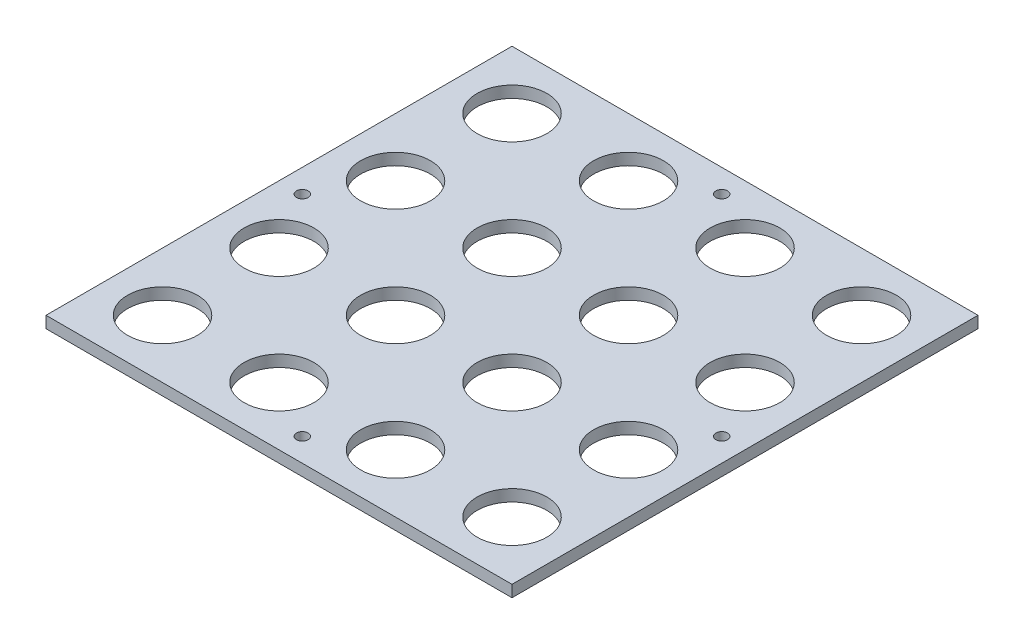
ISO-10303-21;
HEADER;
FILE_DESCRIPTION(('STEP AP214'),'2;1');
FILE_NAME('part.step','',(''),(''),'','','');
FILE_SCHEMA(('AUTOMOTIVE_DESIGN { 1 0 10303 214 1 1 1 1 }'));
ENDSEC;
DATA;
#1=APPLICATION_CONTEXT('core data for automotive mechanical design processes');
#2=APPLICATION_PROTOCOL_DEFINITION('international standard','automotive_design',2000,#1);
#3=PRODUCT_CONTEXT('',#1,'mechanical');
#4=PRODUCT('Part','Part','',(#3));
#5=PRODUCT_RELATED_PRODUCT_CATEGORY('part','',(#4));
#6=PRODUCT_DEFINITION_FORMATION('','',#4);
#7=PRODUCT_DEFINITION_CONTEXT('part definition',#1,'design');
#8=PRODUCT_DEFINITION('design','',#6,#7);
#9=PRODUCT_DEFINITION_SHAPE('','',#8);
#10=(LENGTH_UNIT() NAMED_UNIT(*) SI_UNIT(.MILLI.,.METRE.));
#11=(NAMED_UNIT(*) PLANE_ANGLE_UNIT() SI_UNIT($,.RADIAN.));
#12=(NAMED_UNIT(*) SI_UNIT($,.STERADIAN.) SOLID_ANGLE_UNIT());
#13=UNCERTAINTY_MEASURE_WITH_UNIT(LENGTH_MEASURE(1.E-05),#10,'distance_accuracy_value','');
#14=(GEOMETRIC_REPRESENTATION_CONTEXT(3) GLOBAL_UNCERTAINTY_ASSIGNED_CONTEXT((#13)) GLOBAL_UNIT_ASSIGNED_CONTEXT((#10,
#11,#12)) REPRESENTATION_CONTEXT('',''));
#15=CARTESIAN_POINT('',(0.,0.,0.));
#16=DIRECTION('',(0.,0.,1.));
#17=DIRECTION('',(1.,0.,0.));
#18=AXIS2_PLACEMENT_3D('',#15,#16,#17);
#19=CARTESIAN_POINT('',(0.,6.35,0.));
#20=DIRECTION('',(0.,1.,0.));
#21=DIRECTION('',(0.,0.,1.));
#22=AXIS2_PLACEMENT_3D('',#19,#20,#21);
#23=PLANE('',#22);
#24=CARTESIAN_POINT('',(-95.2499999999987,6.35,31.7499999999999));
#25=DIRECTION('',(0.,1.,0.));
#26=DIRECTION('',(0.,0.,1.));
#27=AXIS2_PLACEMENT_3D('',#24,#25,#26);
#28=CIRCLE('',#27,19.);
#29=CARTESIAN_POINT('',(-95.2499999999987,6.35,50.7499999999999));
#30=VERTEX_POINT('',#29);
#31=EDGE_CURVE('E218',#30,#30,#28,.T.);
#32=ORIENTED_EDGE('',*,*,#31,.F.);
#33=EDGE_LOOP('',(#32));
#34=FACE_BOUND('',#33,.T.);
#35=CARTESIAN_POINT('',(95.2500000000019,6.35,95.2499999999999));
#36=DIRECTION('',(0.,1.,0.));
#37=DIRECTION('',(0.,0.,1.));
#38=AXIS2_PLACEMENT_3D('',#35,#36,#37);
#39=CIRCLE('',#38,19.);
#40=CARTESIAN_POINT('',(95.2500000000019,6.35,114.25));
#41=VERTEX_POINT('',#40);
#42=EDGE_CURVE('E206',#41,#41,#39,.T.);
#43=ORIENTED_EDGE('',*,*,#42,.F.);
#44=EDGE_LOOP('',(#43));
#45=FACE_BOUND('',#44,.T.);
#46=CARTESIAN_POINT('',(-31.7499999999981,6.35,95.2499999999999));
#47=DIRECTION('',(0.,1.,0.));
#48=DIRECTION('',(0.,0.,1.));
#49=AXIS2_PLACEMENT_3D('',#46,#47,#48);
#50=CIRCLE('',#49,19.);
#51=CARTESIAN_POINT('',(-31.7499999999981,6.35,114.25));
#52=VERTEX_POINT('',#51);
#53=EDGE_CURVE('E194',#52,#52,#50,.T.);
#54=ORIENTED_EDGE('',*,*,#53,.F.);
#55=EDGE_LOOP('',(#54));
#56=FACE_BOUND('',#55,.T.);
#57=CARTESIAN_POINT('',(31.7500000000012,6.35,31.7499999999999));
#58=DIRECTION('',(0.,1.,0.));
#59=DIRECTION('',(0.,0.,1.));
#60=AXIS2_PLACEMENT_3D('',#57,#58,#59);
#61=CIRCLE('',#60,19.);
#62=CARTESIAN_POINT('',(31.7500000000012,6.35,50.7499999999999));
#63=VERTEX_POINT('',#62);
#64=EDGE_CURVE('E182',#63,#63,#61,.T.);
#65=ORIENTED_EDGE('',*,*,#64,.F.);
#66=EDGE_LOOP('',(#65));
#67=FACE_BOUND('',#66,.T.);
#68=CARTESIAN_POINT('',(95.2500000000005,6.35,-31.7500000000001));
#69=DIRECTION('',(0.,1.,0.));
#70=DIRECTION('',(0.,0.,1.));
#71=AXIS2_PLACEMENT_3D('',#68,#69,#70);
#72=CIRCLE('',#71,19.);
#73=CARTESIAN_POINT('',(95.2500000000005,6.35,-12.7500000000001));
#74=VERTEX_POINT('',#73);
#75=EDGE_CURVE('E170',#74,#74,#72,.T.);
#76=ORIENTED_EDGE('',*,*,#75,.F.);
#77=EDGE_LOOP('',(#76));
#78=FACE_BOUND('',#77,.T.);
#79=CARTESIAN_POINT('',(-31.7499999999994,6.35,-31.7500000000001));
#80=DIRECTION('',(0.,1.,0.));
#81=DIRECTION('',(0.,0.,1.));
#82=AXIS2_PLACEMENT_3D('',#79,#80,#81);
#83=CIRCLE('',#82,19.);
#84=CARTESIAN_POINT('',(-31.7499999999994,6.35,-12.7500000000001));
#85=VERTEX_POINT('',#84);
#86=EDGE_CURVE('E158',#85,#85,#83,.T.);
#87=ORIENTED_EDGE('',*,*,#86,.F.);
#88=EDGE_LOOP('',(#87));
#89=FACE_BOUND('',#88,.T.);
#90=CARTESIAN_POINT('',(0.,6.35,-114.3));
#91=DIRECTION('',(0.,1.,0.));
#92=DIRECTION('',(0.,0.,1.));
#93=AXIS2_PLACEMENT_3D('',#90,#91,#92);
#94=CIRCLE('',#93,3.175);
#95=CARTESIAN_POINT('',(0.,6.35,-111.125));
#96=VERTEX_POINT('',#95);
#97=EDGE_CURVE('E146',#96,#96,#94,.T.);
#98=ORIENTED_EDGE('',*,*,#97,.F.);
#99=EDGE_LOOP('',(#98));
#100=FACE_BOUND('',#99,.T.);
#101=CARTESIAN_POINT('',(95.2499999999999,6.35,-95.2500000000001));
#102=DIRECTION('',(0.,1.,0.));
#103=DIRECTION('',(0.,0.,1.));
#104=AXIS2_PLACEMENT_3D('',#101,#102,#103);
#105=CIRCLE('',#104,19.);
#106=CARTESIAN_POINT('',(95.2499999999999,6.35,-76.2500000000001));
#107=VERTEX_POINT('',#106);
#108=EDGE_CURVE('E134',#107,#107,#105,.T.);
#109=ORIENTED_EDGE('',*,*,#108,.F.);
#110=EDGE_LOOP('',(#109));
#111=FACE_BOUND('',#110,.T.);
#112=CARTESIAN_POINT('',(-31.7500000000001,6.35,-95.2500000000001));
#113=DIRECTION('',(0.,1.,0.));
#114=DIRECTION('',(0.,0.,1.));
#115=AXIS2_PLACEMENT_3D('',#112,#113,#114);
#116=CIRCLE('',#115,19.);
#117=CARTESIAN_POINT('',(-31.7500000000001,6.35,-76.2500000000001));
#118=VERTEX_POINT('',#117);
#119=EDGE_CURVE('E122',#118,#118,#116,.T.);
#120=ORIENTED_EDGE('',*,*,#119,.F.);
#121=EDGE_LOOP('',(#120));
#122=FACE_BOUND('',#121,.T.);
#123=CARTESIAN_POINT('',(-95.25,6.35,-95.2500000000001));
#124=DIRECTION('',(0.,1.,0.));
#125=DIRECTION('',(0.,0.,1.));
#126=AXIS2_PLACEMENT_3D('',#123,#124,#125);
#127=CIRCLE('',#126,19.);
#128=CARTESIAN_POINT('',(-95.25,6.35,-76.2500000000001));
#129=VERTEX_POINT('',#128);
#130=EDGE_CURVE('E101',#129,#129,#127,.T.);
#131=ORIENTED_EDGE('',*,*,#130,.F.);
#132=EDGE_LOOP('',(#131));
#133=FACE_BOUND('',#132,.T.);
#134=DIRECTION('',(0.,0.,-1.));
#135=VECTOR('',#134,1.);
#136=CARTESIAN_POINT('',(127.,6.35,-127.));
#137=LINE('',#136,#135);
#138=CARTESIAN_POINT('',(127.,6.35,127.));
#139=VERTEX_POINT('',#138);
#140=CARTESIAN_POINT('',(127.,6.35,-127.));
#141=VERTEX_POINT('',#140);
#142=EDGE_CURVE('E86',#139,#141,#137,.T.);
#143=ORIENTED_EDGE('',*,*,#142,.T.);
#144=DIRECTION('',(-1.,0.,0.));
#145=VECTOR('',#144,1.);
#146=CARTESIAN_POINT('',(-127.,6.35,-127.));
#147=LINE('',#146,#145);
#148=CARTESIAN_POINT('',(-127.,6.35,-127.));
#149=VERTEX_POINT('',#148);
#150=EDGE_CURVE('E81',#141,#149,#147,.T.);
#151=ORIENTED_EDGE('',*,*,#150,.T.);
#152=DIRECTION('',(0.,0.,1.));
#153=VECTOR('',#152,1.);
#154=CARTESIAN_POINT('',(-127.,6.35,-127.));
#155=LINE('',#154,#153);
#156=CARTESIAN_POINT('',(-127.,6.35,127.));
#157=VERTEX_POINT('',#156);
#158=EDGE_CURVE('E84',#149,#157,#155,.T.);
#159=ORIENTED_EDGE('',*,*,#158,.T.);
#160=DIRECTION('',(1.,0.,0.));
#161=VECTOR('',#160,1.);
#162=CARTESIAN_POINT('',(-127.,6.35,127.));
#163=LINE('',#162,#161);
#164=EDGE_CURVE('E51',#157,#139,#163,.T.);
#165=ORIENTED_EDGE('',*,*,#164,.T.);
#166=EDGE_LOOP('',(#143,#151,#159,#165));
#167=FACE_BOUND('',#166,.T.);
#168=CARTESIAN_POINT('',(-114.3,6.35,0.));
#169=DIRECTION('',(0.,1.,0.));
#170=DIRECTION('',(0.,0.,1.));
#171=AXIS2_PLACEMENT_3D('',#168,#169,#170);
#172=CIRCLE('',#171,3.175);
#173=CARTESIAN_POINT('',(-114.3,6.35,3.17499999999994));
#174=VERTEX_POINT('',#173);
#175=EDGE_CURVE('E116',#174,#174,#172,.T.);
#176=ORIENTED_EDGE('',*,*,#175,.F.);
#177=EDGE_LOOP('',(#176));
#178=FACE_BOUND('',#177,.T.);
#179=CARTESIAN_POINT('',(31.7499999999999,6.35,-95.2500000000001));
#180=DIRECTION('',(0.,1.,0.));
#181=DIRECTION('',(0.,0.,1.));
#182=AXIS2_PLACEMENT_3D('',#179,#180,#181);
#183=CIRCLE('',#182,19.);
#184=CARTESIAN_POINT('',(31.7499999999999,6.35,-76.2500000000001));
#185=VERTEX_POINT('',#184);
#186=EDGE_CURVE('E128',#185,#185,#183,.T.);
#187=ORIENTED_EDGE('',*,*,#186,.F.);
#188=EDGE_LOOP('',(#187));
#189=FACE_BOUND('',#188,.T.);
#190=CARTESIAN_POINT('',(114.3,6.35,0.));
#191=DIRECTION('',(0.,1.,0.));
#192=DIRECTION('',(0.,0.,1.));
#193=AXIS2_PLACEMENT_3D('',#190,#191,#192);
#194=CIRCLE('',#193,3.175);
#195=CARTESIAN_POINT('',(114.3,6.35,3.175));
#196=VERTEX_POINT('',#195);
#197=EDGE_CURVE('E140',#196,#196,#194,.T.);
#198=ORIENTED_EDGE('',*,*,#197,.F.);
#199=EDGE_LOOP('',(#198));
#200=FACE_BOUND('',#199,.T.);
#201=CARTESIAN_POINT('',(0.,6.35,114.3));
#202=DIRECTION('',(0.,1.,0.));
#203=DIRECTION('',(0.,0.,1.));
#204=AXIS2_PLACEMENT_3D('',#201,#202,#203);
#205=CIRCLE('',#204,3.175);
#206=CARTESIAN_POINT('',(0.,6.35,117.475));
#207=VERTEX_POINT('',#206);
#208=EDGE_CURVE('E152',#207,#207,#205,.T.);
#209=ORIENTED_EDGE('',*,*,#208,.F.);
#210=EDGE_LOOP('',(#209));
#211=FACE_BOUND('',#210,.T.);
#212=CARTESIAN_POINT('',(31.7500000000006,6.35,-31.7500000000001));
#213=DIRECTION('',(0.,1.,0.));
#214=DIRECTION('',(0.,0.,1.));
#215=AXIS2_PLACEMENT_3D('',#212,#213,#214);
#216=CIRCLE('',#215,19.);
#217=CARTESIAN_POINT('',(31.7500000000006,6.35,-12.7500000000001));
#218=VERTEX_POINT('',#217);
#219=EDGE_CURVE('E164',#218,#218,#216,.T.);
#220=ORIENTED_EDGE('',*,*,#219,.F.);
#221=EDGE_LOOP('',(#220));
#222=FACE_BOUND('',#221,.T.);
#223=CARTESIAN_POINT('',(-31.7499999999987,6.35,31.7499999999999));
#224=DIRECTION('',(0.,1.,0.));
#225=DIRECTION('',(0.,0.,1.));
#226=AXIS2_PLACEMENT_3D('',#223,#224,#225);
#227=CIRCLE('',#226,19.);
#228=CARTESIAN_POINT('',(-31.7499999999987,6.35,50.75));
#229=VERTEX_POINT('',#228);
#230=EDGE_CURVE('E176',#229,#229,#227,.T.);
#231=ORIENTED_EDGE('',*,*,#230,.F.);
#232=EDGE_LOOP('',(#231));
#233=FACE_BOUND('',#232,.T.);
#234=CARTESIAN_POINT('',(95.2500000000012,6.35,31.7499999999999));
#235=DIRECTION('',(0.,1.,0.));
#236=DIRECTION('',(0.,0.,1.));
#237=AXIS2_PLACEMENT_3D('',#234,#235,#236);
#238=CIRCLE('',#237,19.);
#239=CARTESIAN_POINT('',(95.2500000000012,6.35,50.75));
#240=VERTEX_POINT('',#239);
#241=EDGE_CURVE('E188',#240,#240,#238,.T.);
#242=ORIENTED_EDGE('',*,*,#241,.F.);
#243=EDGE_LOOP('',(#242));
#244=FACE_BOUND('',#243,.T.);
#245=CARTESIAN_POINT('',(31.7500000000019,6.35,95.2499999999999));
#246=DIRECTION('',(0.,1.,0.));
#247=DIRECTION('',(0.,0.,1.));
#248=AXIS2_PLACEMENT_3D('',#245,#246,#247);
#249=CIRCLE('',#248,19.);
#250=CARTESIAN_POINT('',(31.7500000000019,6.35,114.25));
#251=VERTEX_POINT('',#250);
#252=EDGE_CURVE('E200',#251,#251,#249,.T.);
#253=ORIENTED_EDGE('',*,*,#252,.F.);
#254=EDGE_LOOP('',(#253));
#255=FACE_BOUND('',#254,.T.);
#256=CARTESIAN_POINT('',(-95.2499999999994,6.35,-31.7500000000001));
#257=DIRECTION('',(0.,1.,0.));
#258=DIRECTION('',(0.,0.,1.));
#259=AXIS2_PLACEMENT_3D('',#256,#257,#258);
#260=CIRCLE('',#259,19.);
#261=CARTESIAN_POINT('',(-95.2499999999994,6.35,-12.7500000000001));
#262=VERTEX_POINT('',#261);
#263=EDGE_CURVE('E212',#262,#262,#260,.T.);
#264=ORIENTED_EDGE('',*,*,#263,.F.);
#265=EDGE_LOOP('',(#264));
#266=FACE_BOUND('',#265,.T.);
#267=CARTESIAN_POINT('',(-95.249999999998,6.35,95.2499999999999));
#268=DIRECTION('',(0.,1.,0.));
#269=DIRECTION('',(0.,0.,1.));
#270=AXIS2_PLACEMENT_3D('',#267,#268,#269);
#271=CIRCLE('',#270,19.);
#272=CARTESIAN_POINT('',(-95.249999999998,6.35,114.25));
#273=VERTEX_POINT('',#272);
#274=EDGE_CURVE('E224',#273,#273,#271,.T.);
#275=ORIENTED_EDGE('',*,*,#274,.F.);
#276=EDGE_LOOP('',(#275));
#277=FACE_BOUND('',#276,.T.);
#278=ADVANCED_FACE('F34',(#34,#45,#56,#67,#78,#89,#100,#111,#122,#133,#167,#178,#189,#200,#211,
#222,#233,#244,#255,#266,#277),#23,.T.);
#279=CARTESIAN_POINT('',(0.,0.,0.));
#280=DIRECTION('',(0.,1.,0.));
#281=DIRECTION('',(0.,0.,1.));
#282=AXIS2_PLACEMENT_3D('',#279,#280,#281);
#283=PLANE('',#282);
#284=DIRECTION('',(0.,0.,-1.));
#285=VECTOR('',#284,1.);
#286=CARTESIAN_POINT('',(127.,0.,-127.));
#287=LINE('',#286,#285);
#288=CARTESIAN_POINT('',(127.,0.,127.));
#289=VERTEX_POINT('',#288);
#290=CARTESIAN_POINT('',(127.,0.,-127.));
#291=VERTEX_POINT('',#290);
#292=EDGE_CURVE('E98',#289,#291,#287,.T.);
#293=ORIENTED_EDGE('',*,*,#292,.F.);
#294=DIRECTION('',(1.,0.,0.));
#295=VECTOR('',#294,1.);
#296=CARTESIAN_POINT('',(-127.,0.,127.));
#297=LINE('',#296,#295);
#298=CARTESIAN_POINT('',(-127.,0.,127.));
#299=VERTEX_POINT('',#298);
#300=EDGE_CURVE('E74',#299,#289,#297,.T.);
#301=ORIENTED_EDGE('',*,*,#300,.F.);
#302=DIRECTION('',(0.,0.,1.));
#303=VECTOR('',#302,1.);
#304=CARTESIAN_POINT('',(-127.,0.,-127.));
#305=LINE('',#304,#303);
#306=CARTESIAN_POINT('',(-127.,0.,-127.));
#307=VERTEX_POINT('',#306);
#308=EDGE_CURVE('E68',#307,#299,#305,.T.);
#309=ORIENTED_EDGE('',*,*,#308,.F.);
#310=DIRECTION('',(-1.,0.,0.));
#311=VECTOR('',#310,1.);
#312=CARTESIAN_POINT('',(-127.,0.,-127.));
#313=LINE('',#312,#311);
#314=EDGE_CURVE('E90',#291,#307,#313,.T.);
#315=ORIENTED_EDGE('',*,*,#314,.F.);
#316=EDGE_LOOP('',(#293,#301,#309,#315));
#317=FACE_BOUND('',#316,.T.);
#318=CARTESIAN_POINT('',(-95.25,0.,-95.2500000000001));
#319=DIRECTION('',(0.,1.,0.));
#320=DIRECTION('',(0.,0.,1.));
#321=AXIS2_PLACEMENT_3D('',#318,#319,#320);
#322=CIRCLE('',#321,19.);
#323=CARTESIAN_POINT('',(-95.25,0.,-76.2500000000001));
#324=VERTEX_POINT('',#323);
#325=EDGE_CURVE('E113',#324,#324,#322,.T.);
#326=ORIENTED_EDGE('',*,*,#325,.T.);
#327=EDGE_LOOP('',(#326));
#328=FACE_BOUND('',#327,.T.);
#329=CARTESIAN_POINT('',(-114.3,0.,0.));
#330=DIRECTION('',(0.,1.,0.));
#331=DIRECTION('',(0.,0.,1.));
#332=AXIS2_PLACEMENT_3D('',#329,#330,#331);
#333=CIRCLE('',#332,3.175);
#334=CARTESIAN_POINT('',(-114.3,0.,3.17499999999994));
#335=VERTEX_POINT('',#334);
#336=EDGE_CURVE('E119',#335,#335,#333,.T.);
#337=ORIENTED_EDGE('',*,*,#336,.T.);
#338=EDGE_LOOP('',(#337));
#339=FACE_BOUND('',#338,.T.);
#340=CARTESIAN_POINT('',(-31.7500000000001,0.,-95.2500000000001));
#341=DIRECTION('',(0.,1.,0.));
#342=DIRECTION('',(0.,0.,1.));
#343=AXIS2_PLACEMENT_3D('',#340,#341,#342);
#344=CIRCLE('',#343,19.);
#345=CARTESIAN_POINT('',(-31.7500000000001,0.,-76.2500000000001));
#346=VERTEX_POINT('',#345);
#347=EDGE_CURVE('E125',#346,#346,#344,.T.);
#348=ORIENTED_EDGE('',*,*,#347,.T.);
#349=EDGE_LOOP('',(#348));
#350=FACE_BOUND('',#349,.T.);
#351=CARTESIAN_POINT('',(31.7499999999999,0.,-95.2500000000001));
#352=DIRECTION('',(0.,1.,0.));
#353=DIRECTION('',(0.,0.,1.));
#354=AXIS2_PLACEMENT_3D('',#351,#352,#353);
#355=CIRCLE('',#354,19.);
#356=CARTESIAN_POINT('',(31.7499999999999,0.,-76.2500000000001));
#357=VERTEX_POINT('',#356);
#358=EDGE_CURVE('E131',#357,#357,#355,.T.);
#359=ORIENTED_EDGE('',*,*,#358,.T.);
#360=EDGE_LOOP('',(#359));
#361=FACE_BOUND('',#360,.T.);
#362=CARTESIAN_POINT('',(95.2499999999999,0.,-95.2500000000001));
#363=DIRECTION('',(0.,1.,0.));
#364=DIRECTION('',(0.,0.,1.));
#365=AXIS2_PLACEMENT_3D('',#362,#363,#364);
#366=CIRCLE('',#365,19.);
#367=CARTESIAN_POINT('',(95.2499999999999,0.,-76.2500000000001));
#368=VERTEX_POINT('',#367);
#369=EDGE_CURVE('E137',#368,#368,#366,.T.);
#370=ORIENTED_EDGE('',*,*,#369,.T.);
#371=EDGE_LOOP('',(#370));
#372=FACE_BOUND('',#371,.T.);
#373=CARTESIAN_POINT('',(114.3,0.,0.));
#374=DIRECTION('',(0.,1.,0.));
#375=DIRECTION('',(0.,0.,1.));
#376=AXIS2_PLACEMENT_3D('',#373,#374,#375);
#377=CIRCLE('',#376,3.175);
#378=CARTESIAN_POINT('',(114.3,0.,3.175));
#379=VERTEX_POINT('',#378);
#380=EDGE_CURVE('E143',#379,#379,#377,.T.);
#381=ORIENTED_EDGE('',*,*,#380,.T.);
#382=EDGE_LOOP('',(#381));
#383=FACE_BOUND('',#382,.T.);
#384=CARTESIAN_POINT('',(0.,0.,-114.3));
#385=DIRECTION('',(0.,1.,0.));
#386=DIRECTION('',(0.,0.,1.));
#387=AXIS2_PLACEMENT_3D('',#384,#385,#386);
#388=CIRCLE('',#387,3.175);
#389=CARTESIAN_POINT('',(0.,0.,-111.125));
#390=VERTEX_POINT('',#389);
#391=EDGE_CURVE('E149',#390,#390,#388,.T.);
#392=ORIENTED_EDGE('',*,*,#391,.T.);
#393=EDGE_LOOP('',(#392));
#394=FACE_BOUND('',#393,.T.);
#395=CARTESIAN_POINT('',(0.,0.,114.3));
#396=DIRECTION('',(0.,1.,0.));
#397=DIRECTION('',(0.,0.,1.));
#398=AXIS2_PLACEMENT_3D('',#395,#396,#397);
#399=CIRCLE('',#398,3.175);
#400=CARTESIAN_POINT('',(0.,0.,117.475));
#401=VERTEX_POINT('',#400);
#402=EDGE_CURVE('E155',#401,#401,#399,.T.);
#403=ORIENTED_EDGE('',*,*,#402,.T.);
#404=EDGE_LOOP('',(#403));
#405=FACE_BOUND('',#404,.T.);
#406=CARTESIAN_POINT('',(-31.7499999999994,0.,-31.7500000000001));
#407=DIRECTION('',(0.,1.,0.));
#408=DIRECTION('',(0.,0.,1.));
#409=AXIS2_PLACEMENT_3D('',#406,#407,#408);
#410=CIRCLE('',#409,19.);
#411=CARTESIAN_POINT('',(-31.7499999999994,0.,-12.7500000000001));
#412=VERTEX_POINT('',#411);
#413=EDGE_CURVE('E161',#412,#412,#410,.T.);
#414=ORIENTED_EDGE('',*,*,#413,.T.);
#415=EDGE_LOOP('',(#414));
#416=FACE_BOUND('',#415,.T.);
#417=CARTESIAN_POINT('',(31.7500000000006,0.,-31.7500000000001));
#418=DIRECTION('',(0.,1.,0.));
#419=DIRECTION('',(0.,0.,1.));
#420=AXIS2_PLACEMENT_3D('',#417,#418,#419);
#421=CIRCLE('',#420,19.);
#422=CARTESIAN_POINT('',(31.7500000000006,0.,-12.7500000000001));
#423=VERTEX_POINT('',#422);
#424=EDGE_CURVE('E167',#423,#423,#421,.T.);
#425=ORIENTED_EDGE('',*,*,#424,.T.);
#426=EDGE_LOOP('',(#425));
#427=FACE_BOUND('',#426,.T.);
#428=CARTESIAN_POINT('',(95.2500000000005,0.,-31.7500000000001));
#429=DIRECTION('',(0.,1.,0.));
#430=DIRECTION('',(0.,0.,1.));
#431=AXIS2_PLACEMENT_3D('',#428,#429,#430);
#432=CIRCLE('',#431,19.);
#433=CARTESIAN_POINT('',(95.2500000000005,0.,-12.7500000000001));
#434=VERTEX_POINT('',#433);
#435=EDGE_CURVE('E173',#434,#434,#432,.T.);
#436=ORIENTED_EDGE('',*,*,#435,.T.);
#437=EDGE_LOOP('',(#436));
#438=FACE_BOUND('',#437,.T.);
#439=CARTESIAN_POINT('',(-31.7499999999987,0.,31.7499999999999));
#440=DIRECTION('',(0.,1.,0.));
#441=DIRECTION('',(0.,0.,1.));
#442=AXIS2_PLACEMENT_3D('',#439,#440,#441);
#443=CIRCLE('',#442,19.);
#444=CARTESIAN_POINT('',(-31.7499999999987,0.,50.75));
#445=VERTEX_POINT('',#444);
#446=EDGE_CURVE('E179',#445,#445,#443,.T.);
#447=ORIENTED_EDGE('',*,*,#446,.T.);
#448=EDGE_LOOP('',(#447));
#449=FACE_BOUND('',#448,.T.);
#450=CARTESIAN_POINT('',(31.7500000000012,0.,31.7499999999999));
#451=DIRECTION('',(0.,1.,0.));
#452=DIRECTION('',(0.,0.,1.));
#453=AXIS2_PLACEMENT_3D('',#450,#451,#452);
#454=CIRCLE('',#453,19.);
#455=CARTESIAN_POINT('',(31.7500000000012,0.,50.7499999999999));
#456=VERTEX_POINT('',#455);
#457=EDGE_CURVE('E185',#456,#456,#454,.T.);
#458=ORIENTED_EDGE('',*,*,#457,.T.);
#459=EDGE_LOOP('',(#458));
#460=FACE_BOUND('',#459,.T.);
#461=CARTESIAN_POINT('',(95.2500000000012,0.,31.7499999999999));
#462=DIRECTION('',(0.,1.,0.));
#463=DIRECTION('',(0.,0.,1.));
#464=AXIS2_PLACEMENT_3D('',#461,#462,#463);
#465=CIRCLE('',#464,19.);
#466=CARTESIAN_POINT('',(95.2500000000012,0.,50.75));
#467=VERTEX_POINT('',#466);
#468=EDGE_CURVE('E191',#467,#467,#465,.T.);
#469=ORIENTED_EDGE('',*,*,#468,.T.);
#470=EDGE_LOOP('',(#469));
#471=FACE_BOUND('',#470,.T.);
#472=CARTESIAN_POINT('',(-31.7499999999981,0.,95.2499999999999));
#473=DIRECTION('',(0.,1.,0.));
#474=DIRECTION('',(0.,0.,1.));
#475=AXIS2_PLACEMENT_3D('',#472,#473,#474);
#476=CIRCLE('',#475,19.);
#477=CARTESIAN_POINT('',(-31.7499999999981,0.,114.25));
#478=VERTEX_POINT('',#477);
#479=EDGE_CURVE('E197',#478,#478,#476,.T.);
#480=ORIENTED_EDGE('',*,*,#479,.T.);
#481=EDGE_LOOP('',(#480));
#482=FACE_BOUND('',#481,.T.);
#483=CARTESIAN_POINT('',(31.7500000000019,0.,95.2499999999999));
#484=DIRECTION('',(0.,1.,0.));
#485=DIRECTION('',(0.,0.,1.));
#486=AXIS2_PLACEMENT_3D('',#483,#484,#485);
#487=CIRCLE('',#486,19.);
#488=CARTESIAN_POINT('',(31.7500000000019,0.,114.25));
#489=VERTEX_POINT('',#488);
#490=EDGE_CURVE('E203',#489,#489,#487,.T.);
#491=ORIENTED_EDGE('',*,*,#490,.T.);
#492=EDGE_LOOP('',(#491));
#493=FACE_BOUND('',#492,.T.);
#494=CARTESIAN_POINT('',(95.2500000000019,0.,95.2499999999999));
#495=DIRECTION('',(0.,1.,0.));
#496=DIRECTION('',(0.,0.,1.));
#497=AXIS2_PLACEMENT_3D('',#494,#495,#496);
#498=CIRCLE('',#497,19.);
#499=CARTESIAN_POINT('',(95.2500000000019,0.,114.25));
#500=VERTEX_POINT('',#499);
#501=EDGE_CURVE('E209',#500,#500,#498,.T.);
#502=ORIENTED_EDGE('',*,*,#501,.T.);
#503=EDGE_LOOP('',(#502));
#504=FACE_BOUND('',#503,.T.);
#505=CARTESIAN_POINT('',(-95.2499999999994,0.,-31.7500000000001));
#506=DIRECTION('',(0.,1.,0.));
#507=DIRECTION('',(0.,0.,1.));
#508=AXIS2_PLACEMENT_3D('',#505,#506,#507);
#509=CIRCLE('',#508,19.);
#510=CARTESIAN_POINT('',(-95.2499999999994,0.,-12.7500000000001));
#511=VERTEX_POINT('',#510);
#512=EDGE_CURVE('E215',#511,#511,#509,.T.);
#513=ORIENTED_EDGE('',*,*,#512,.T.);
#514=EDGE_LOOP('',(#513));
#515=FACE_BOUND('',#514,.T.);
#516=CARTESIAN_POINT('',(-95.2499999999987,0.,31.7499999999999));
#517=DIRECTION('',(0.,1.,0.));
#518=DIRECTION('',(0.,0.,1.));
#519=AXIS2_PLACEMENT_3D('',#516,#517,#518);
#520=CIRCLE('',#519,19.);
#521=CARTESIAN_POINT('',(-95.2499999999987,0.,50.7499999999999));
#522=VERTEX_POINT('',#521);
#523=EDGE_CURVE('E221',#522,#522,#520,.T.);
#524=ORIENTED_EDGE('',*,*,#523,.T.);
#525=EDGE_LOOP('',(#524));
#526=FACE_BOUND('',#525,.T.);
#527=CARTESIAN_POINT('',(-95.249999999998,0.,95.2499999999999));
#528=DIRECTION('',(0.,1.,0.));
#529=DIRECTION('',(0.,0.,1.));
#530=AXIS2_PLACEMENT_3D('',#527,#528,#529);
#531=CIRCLE('',#530,19.);
#532=CARTESIAN_POINT('',(-95.249999999998,0.,114.25));
#533=VERTEX_POINT('',#532);
#534=EDGE_CURVE('E227',#533,#533,#531,.T.);
#535=ORIENTED_EDGE('',*,*,#534,.T.);
#536=EDGE_LOOP('',(#535));
#537=FACE_BOUND('',#536,.T.);
#538=ADVANCED_FACE('F109',(#317,#328,#339,#350,#361,#372,#383,#394,#405,#416,#427,#438,#449,
#460,#471,#482,#493,#504,#515,#526,#537),#283,.F.);
#539=CARTESIAN_POINT('',(127.,6.35,-127.));
#540=DIRECTION('',(-1.,0.,0.));
#541=DIRECTION('',(0.,0.,1.));
#542=AXIS2_PLACEMENT_3D('',#539,#540,#541);
#543=PLANE('',#542);
#544=ORIENTED_EDGE('',*,*,#292,.T.);
#545=DIRECTION('',(0.,-1.,0.));
#546=VECTOR('',#545,1.);
#547=CARTESIAN_POINT('',(127.,6.35,-127.));
#548=LINE('',#547,#546);
#549=EDGE_CURVE('E11',#141,#291,#548,.T.);
#550=ORIENTED_EDGE('',*,*,#549,.F.);
#551=ORIENTED_EDGE('',*,*,#142,.F.);
#552=DIRECTION('',(0.,-1.,0.));
#553=VECTOR('',#552,1.);
#554=CARTESIAN_POINT('',(127.,6.35,127.));
#555=LINE('',#554,#553);
#556=EDGE_CURVE('E94',#139,#289,#555,.T.);
#557=ORIENTED_EDGE('',*,*,#556,.T.);
#558=EDGE_LOOP('',(#544,#550,#551,#557));
#559=FACE_BOUND('',#558,.T.);
#560=ADVANCED_FACE('F36',(#559),#543,.F.);
#561=CARTESIAN_POINT('',(-127.,6.35,-127.));
#562=DIRECTION('',(0.,0.,1.));
#563=DIRECTION('',(1.,0.,0.));
#564=AXIS2_PLACEMENT_3D('',#561,#562,#563);
#565=PLANE('',#564);
#566=ORIENTED_EDGE('',*,*,#314,.T.);
#567=DIRECTION('',(0.,-1.,0.));
#568=VECTOR('',#567,1.);
#569=CARTESIAN_POINT('',(-127.,6.35,-127.));
#570=LINE('',#569,#568);
#571=EDGE_CURVE('E43',#149,#307,#570,.T.);
#572=ORIENTED_EDGE('',*,*,#571,.F.);
#573=ORIENTED_EDGE('',*,*,#150,.F.);
#574=ORIENTED_EDGE('',*,*,#549,.T.);
#575=EDGE_LOOP('',(#566,#572,#573,#574));
#576=FACE_BOUND('',#575,.T.);
#577=ADVANCED_FACE('F89',(#576),#565,.F.);
#578=CARTESIAN_POINT('',(-127.,6.35,-127.));
#579=DIRECTION('',(1.,0.,0.));
#580=DIRECTION('',(0.,0.,-1.));
#581=AXIS2_PLACEMENT_3D('',#578,#579,#580);
#582=PLANE('',#581);
#583=ORIENTED_EDGE('',*,*,#308,.T.);
#584=DIRECTION('',(0.,-1.,0.));
#585=VECTOR('',#584,1.);
#586=CARTESIAN_POINT('',(-127.,6.35,127.));
#587=LINE('',#586,#585);
#588=EDGE_CURVE('E91',#157,#299,#587,.T.);
#589=ORIENTED_EDGE('',*,*,#588,.F.);
#590=ORIENTED_EDGE('',*,*,#158,.F.);
#591=ORIENTED_EDGE('',*,*,#571,.T.);
#592=EDGE_LOOP('',(#583,#589,#590,#591));
#593=FACE_BOUND('',#592,.T.);
#594=ADVANCED_FACE('F92',(#593),#582,.F.);
#595=CARTESIAN_POINT('',(-127.,6.35,127.));
#596=DIRECTION('',(0.,0.,-1.));
#597=DIRECTION('',(-1.,0.,0.));
#598=AXIS2_PLACEMENT_3D('',#595,#596,#597);
#599=PLANE('',#598);
#600=ORIENTED_EDGE('',*,*,#300,.T.);
#601=ORIENTED_EDGE('',*,*,#556,.F.);
#602=ORIENTED_EDGE('',*,*,#164,.F.);
#603=ORIENTED_EDGE('',*,*,#588,.T.);
#604=EDGE_LOOP('',(#600,#601,#602,#603));
#605=FACE_BOUND('',#604,.T.);
#606=ADVANCED_FACE('F106',(#605),#599,.F.);
#607=CARTESIAN_POINT('',(-95.25,6.35,-95.2500000000001));
#608=DIRECTION('',(0.,-1.,0.));
#609=DIRECTION('',(0.,0.,-1.));
#610=AXIS2_PLACEMENT_3D('',#607,#608,#609);
#611=CYLINDRICAL_SURFACE('',#610,19.);
#612=ORIENTED_EDGE('',*,*,#130,.T.);
#613=EDGE_LOOP('',(#612));
#614=FACE_BOUND('',#613,.T.);
#615=ORIENTED_EDGE('',*,*,#325,.F.);
#616=EDGE_LOOP('',(#615));
#617=FACE_BOUND('',#616,.T.);
#618=ADVANCED_FACE('F246',(#614,#617),#611,.F.);
#619=CARTESIAN_POINT('',(-114.3,6.35,0.));
#620=DIRECTION('',(0.,-1.,0.));
#621=DIRECTION('',(0.,0.,-1.));
#622=AXIS2_PLACEMENT_3D('',#619,#620,#621);
#623=CYLINDRICAL_SURFACE('',#622,3.175);
#624=ORIENTED_EDGE('',*,*,#175,.T.);
#625=EDGE_LOOP('',(#624));
#626=FACE_BOUND('',#625,.T.);
#627=ORIENTED_EDGE('',*,*,#336,.F.);
#628=EDGE_LOOP('',(#627));
#629=FACE_BOUND('',#628,.T.);
#630=ADVANCED_FACE('F292',(#626,#629),#623,.F.);
#631=CARTESIAN_POINT('',(-31.7500000000001,6.35,-95.2500000000001));
#632=DIRECTION('',(0.,-1.,0.));
#633=DIRECTION('',(0.,0.,-1.));
#634=AXIS2_PLACEMENT_3D('',#631,#632,#633);
#635=CYLINDRICAL_SURFACE('',#634,19.);
#636=ORIENTED_EDGE('',*,*,#119,.T.);
#637=EDGE_LOOP('',(#636));
#638=FACE_BOUND('',#637,.T.);
#639=ORIENTED_EDGE('',*,*,#347,.F.);
#640=EDGE_LOOP('',(#639));
#641=FACE_BOUND('',#640,.T.);
#642=ADVANCED_FACE('F300',(#638,#641),#635,.F.);
#643=CARTESIAN_POINT('',(31.7499999999999,6.35,-95.2500000000001));
#644=DIRECTION('',(0.,-1.,0.));
#645=DIRECTION('',(0.,0.,-1.));
#646=AXIS2_PLACEMENT_3D('',#643,#644,#645);
#647=CYLINDRICAL_SURFACE('',#646,19.);
#648=ORIENTED_EDGE('',*,*,#186,.T.);
#649=EDGE_LOOP('',(#648));
#650=FACE_BOUND('',#649,.T.);
#651=ORIENTED_EDGE('',*,*,#358,.F.);
#652=EDGE_LOOP('',(#651));
#653=FACE_BOUND('',#652,.T.);
#654=ADVANCED_FACE('F308',(#650,#653),#647,.F.);
#655=CARTESIAN_POINT('',(95.2499999999999,6.35,-95.2500000000001));
#656=DIRECTION('',(0.,-1.,0.));
#657=DIRECTION('',(0.,0.,-1.));
#658=AXIS2_PLACEMENT_3D('',#655,#656,#657);
#659=CYLINDRICAL_SURFACE('',#658,19.);
#660=ORIENTED_EDGE('',*,*,#108,.T.);
#661=EDGE_LOOP('',(#660));
#662=FACE_BOUND('',#661,.T.);
#663=ORIENTED_EDGE('',*,*,#369,.F.);
#664=EDGE_LOOP('',(#663));
#665=FACE_BOUND('',#664,.T.);
#666=ADVANCED_FACE('F317',(#662,#665),#659,.F.);
#667=CARTESIAN_POINT('',(114.3,6.35,0.));
#668=DIRECTION('',(0.,-1.,0.));
#669=DIRECTION('',(0.,0.,-1.));
#670=AXIS2_PLACEMENT_3D('',#667,#668,#669);
#671=CYLINDRICAL_SURFACE('',#670,3.175);
#672=ORIENTED_EDGE('',*,*,#197,.T.);
#673=EDGE_LOOP('',(#672));
#674=FACE_BOUND('',#673,.T.);
#675=ORIENTED_EDGE('',*,*,#380,.F.);
#676=EDGE_LOOP('',(#675));
#677=FACE_BOUND('',#676,.T.);
#678=ADVANCED_FACE('F326',(#674,#677),#671,.F.);
#679=CARTESIAN_POINT('',(0.,6.35,-114.3));
#680=DIRECTION('',(0.,-1.,0.));
#681=DIRECTION('',(0.,0.,-1.));
#682=AXIS2_PLACEMENT_3D('',#679,#680,#681);
#683=CYLINDRICAL_SURFACE('',#682,3.175);
#684=ORIENTED_EDGE('',*,*,#97,.T.);
#685=EDGE_LOOP('',(#684));
#686=FACE_BOUND('',#685,.T.);
#687=ORIENTED_EDGE('',*,*,#391,.F.);
#688=EDGE_LOOP('',(#687));
#689=FACE_BOUND('',#688,.T.);
#690=ADVANCED_FACE('F335',(#686,#689),#683,.F.);
#691=CARTESIAN_POINT('',(0.,6.35,114.3));
#692=DIRECTION('',(0.,-1.,0.));
#693=DIRECTION('',(0.,0.,-1.));
#694=AXIS2_PLACEMENT_3D('',#691,#692,#693);
#695=CYLINDRICAL_SURFACE('',#694,3.175);
#696=ORIENTED_EDGE('',*,*,#208,.T.);
#697=EDGE_LOOP('',(#696));
#698=FACE_BOUND('',#697,.T.);
#699=ORIENTED_EDGE('',*,*,#402,.F.);
#700=EDGE_LOOP('',(#699));
#701=FACE_BOUND('',#700,.T.);
#702=ADVANCED_FACE('F344',(#698,#701),#695,.F.);
#703=CARTESIAN_POINT('',(-31.7499999999994,6.35,-31.7500000000001));
#704=DIRECTION('',(0.,-1.,0.));
#705=DIRECTION('',(0.,0.,-1.));
#706=AXIS2_PLACEMENT_3D('',#703,#704,#705);
#707=CYLINDRICAL_SURFACE('',#706,19.);
#708=ORIENTED_EDGE('',*,*,#86,.T.);
#709=EDGE_LOOP('',(#708));
#710=FACE_BOUND('',#709,.T.);
#711=ORIENTED_EDGE('',*,*,#413,.F.);
#712=EDGE_LOOP('',(#711));
#713=FACE_BOUND('',#712,.T.);
#714=ADVANCED_FACE('F353',(#710,#713),#707,.F.);
#715=CARTESIAN_POINT('',(31.7500000000006,6.35,-31.7500000000001));
#716=DIRECTION('',(0.,-1.,0.));
#717=DIRECTION('',(0.,0.,-1.));
#718=AXIS2_PLACEMENT_3D('',#715,#716,#717);
#719=CYLINDRICAL_SURFACE('',#718,19.);
#720=ORIENTED_EDGE('',*,*,#219,.T.);
#721=EDGE_LOOP('',(#720));
#722=FACE_BOUND('',#721,.T.);
#723=ORIENTED_EDGE('',*,*,#424,.F.);
#724=EDGE_LOOP('',(#723));
#725=FACE_BOUND('',#724,.T.);
#726=ADVANCED_FACE('F362',(#722,#725),#719,.F.);
#727=CARTESIAN_POINT('',(95.2500000000005,6.35,-31.7500000000001));
#728=DIRECTION('',(0.,-1.,0.));
#729=DIRECTION('',(0.,0.,-1.));
#730=AXIS2_PLACEMENT_3D('',#727,#728,#729);
#731=CYLINDRICAL_SURFACE('',#730,19.);
#732=ORIENTED_EDGE('',*,*,#75,.T.);
#733=EDGE_LOOP('',(#732));
#734=FACE_BOUND('',#733,.T.);
#735=ORIENTED_EDGE('',*,*,#435,.F.);
#736=EDGE_LOOP('',(#735));
#737=FACE_BOUND('',#736,.T.);
#738=ADVANCED_FACE('F371',(#734,#737),#731,.F.);
#739=CARTESIAN_POINT('',(-31.7499999999987,6.35,31.7499999999999));
#740=DIRECTION('',(0.,-1.,0.));
#741=DIRECTION('',(0.,0.,-1.));
#742=AXIS2_PLACEMENT_3D('',#739,#740,#741);
#743=CYLINDRICAL_SURFACE('',#742,19.);
#744=ORIENTED_EDGE('',*,*,#230,.T.);
#745=EDGE_LOOP('',(#744));
#746=FACE_BOUND('',#745,.T.);
#747=ORIENTED_EDGE('',*,*,#446,.F.);
#748=EDGE_LOOP('',(#747));
#749=FACE_BOUND('',#748,.T.);
#750=ADVANCED_FACE('F380',(#746,#749),#743,.F.);
#751=CARTESIAN_POINT('',(31.7500000000012,6.35,31.7499999999999));
#752=DIRECTION('',(0.,-1.,0.));
#753=DIRECTION('',(0.,0.,-1.));
#754=AXIS2_PLACEMENT_3D('',#751,#752,#753);
#755=CYLINDRICAL_SURFACE('',#754,19.);
#756=ORIENTED_EDGE('',*,*,#64,.T.);
#757=EDGE_LOOP('',(#756));
#758=FACE_BOUND('',#757,.T.);
#759=ORIENTED_EDGE('',*,*,#457,.F.);
#760=EDGE_LOOP('',(#759));
#761=FACE_BOUND('',#760,.T.);
#762=ADVANCED_FACE('F389',(#758,#761),#755,.F.);
#763=CARTESIAN_POINT('',(95.2500000000012,6.35,31.7499999999999));
#764=DIRECTION('',(0.,-1.,0.));
#765=DIRECTION('',(0.,0.,-1.));
#766=AXIS2_PLACEMENT_3D('',#763,#764,#765);
#767=CYLINDRICAL_SURFACE('',#766,19.);
#768=ORIENTED_EDGE('',*,*,#241,.T.);
#769=EDGE_LOOP('',(#768));
#770=FACE_BOUND('',#769,.T.);
#771=ORIENTED_EDGE('',*,*,#468,.F.);
#772=EDGE_LOOP('',(#771));
#773=FACE_BOUND('',#772,.T.);
#774=ADVANCED_FACE('F398',(#770,#773),#767,.F.);
#775=CARTESIAN_POINT('',(-31.7499999999981,6.35,95.2499999999999));
#776=DIRECTION('',(0.,-1.,0.));
#777=DIRECTION('',(0.,0.,-1.));
#778=AXIS2_PLACEMENT_3D('',#775,#776,#777);
#779=CYLINDRICAL_SURFACE('',#778,19.);
#780=ORIENTED_EDGE('',*,*,#53,.T.);
#781=EDGE_LOOP('',(#780));
#782=FACE_BOUND('',#781,.T.);
#783=ORIENTED_EDGE('',*,*,#479,.F.);
#784=EDGE_LOOP('',(#783));
#785=FACE_BOUND('',#784,.T.);
#786=ADVANCED_FACE('F407',(#782,#785),#779,.F.);
#787=CARTESIAN_POINT('',(31.7500000000019,6.35,95.2499999999999));
#788=DIRECTION('',(0.,-1.,0.));
#789=DIRECTION('',(0.,0.,-1.));
#790=AXIS2_PLACEMENT_3D('',#787,#788,#789);
#791=CYLINDRICAL_SURFACE('',#790,19.);
#792=ORIENTED_EDGE('',*,*,#252,.T.);
#793=EDGE_LOOP('',(#792));
#794=FACE_BOUND('',#793,.T.);
#795=ORIENTED_EDGE('',*,*,#490,.F.);
#796=EDGE_LOOP('',(#795));
#797=FACE_BOUND('',#796,.T.);
#798=ADVANCED_FACE('F416',(#794,#797),#791,.F.);
#799=CARTESIAN_POINT('',(95.2500000000019,6.35,95.2499999999999));
#800=DIRECTION('',(0.,-1.,0.));
#801=DIRECTION('',(0.,0.,-1.));
#802=AXIS2_PLACEMENT_3D('',#799,#800,#801);
#803=CYLINDRICAL_SURFACE('',#802,19.);
#804=ORIENTED_EDGE('',*,*,#42,.T.);
#805=EDGE_LOOP('',(#804));
#806=FACE_BOUND('',#805,.T.);
#807=ORIENTED_EDGE('',*,*,#501,.F.);
#808=EDGE_LOOP('',(#807));
#809=FACE_BOUND('',#808,.T.);
#810=ADVANCED_FACE('F425',(#806,#809),#803,.F.);
#811=CARTESIAN_POINT('',(-95.2499999999994,6.35,-31.7500000000001));
#812=DIRECTION('',(0.,-1.,0.));
#813=DIRECTION('',(0.,0.,-1.));
#814=AXIS2_PLACEMENT_3D('',#811,#812,#813);
#815=CYLINDRICAL_SURFACE('',#814,19.);
#816=ORIENTED_EDGE('',*,*,#263,.T.);
#817=EDGE_LOOP('',(#816));
#818=FACE_BOUND('',#817,.T.);
#819=ORIENTED_EDGE('',*,*,#512,.F.);
#820=EDGE_LOOP('',(#819));
#821=FACE_BOUND('',#820,.T.);
#822=ADVANCED_FACE('F434',(#818,#821),#815,.F.);
#823=CARTESIAN_POINT('',(-95.2499999999987,6.35,31.7499999999999));
#824=DIRECTION('',(0.,-1.,0.));
#825=DIRECTION('',(0.,0.,-1.));
#826=AXIS2_PLACEMENT_3D('',#823,#824,#825);
#827=CYLINDRICAL_SURFACE('',#826,19.);
#828=ORIENTED_EDGE('',*,*,#31,.T.);
#829=EDGE_LOOP('',(#828));
#830=FACE_BOUND('',#829,.T.);
#831=ORIENTED_EDGE('',*,*,#523,.F.);
#832=EDGE_LOOP('',(#831));
#833=FACE_BOUND('',#832,.T.);
#834=ADVANCED_FACE('F443',(#830,#833),#827,.F.);
#835=CARTESIAN_POINT('',(-95.249999999998,6.35,95.2499999999999));
#836=DIRECTION('',(0.,-1.,0.));
#837=DIRECTION('',(0.,0.,-1.));
#838=AXIS2_PLACEMENT_3D('',#835,#836,#837);
#839=CYLINDRICAL_SURFACE('',#838,19.);
#840=ORIENTED_EDGE('',*,*,#274,.T.);
#841=EDGE_LOOP('',(#840));
#842=FACE_BOUND('',#841,.T.);
#843=ORIENTED_EDGE('',*,*,#534,.F.);
#844=EDGE_LOOP('',(#843));
#845=FACE_BOUND('',#844,.T.);
#846=ADVANCED_FACE('F233',(#842,#845),#839,.F.);
#847=CLOSED_SHELL('',(#278,#538,#560,#577,#594,#606,#618,#630,#642,#654,#666,#678,#690,#702,
#714,#726,#738,#750,#762,#774,#786,#798,#810,#822,#834,#846));
#848=MANIFOLD_SOLID_BREP('B2',#847);
#849=ADVANCED_BREP_SHAPE_REPRESENTATION('',(#18,#848),#14);
#850=SHAPE_DEFINITION_REPRESENTATION(#9,#849);
ENDSEC;
END-ISO-10303-21;
